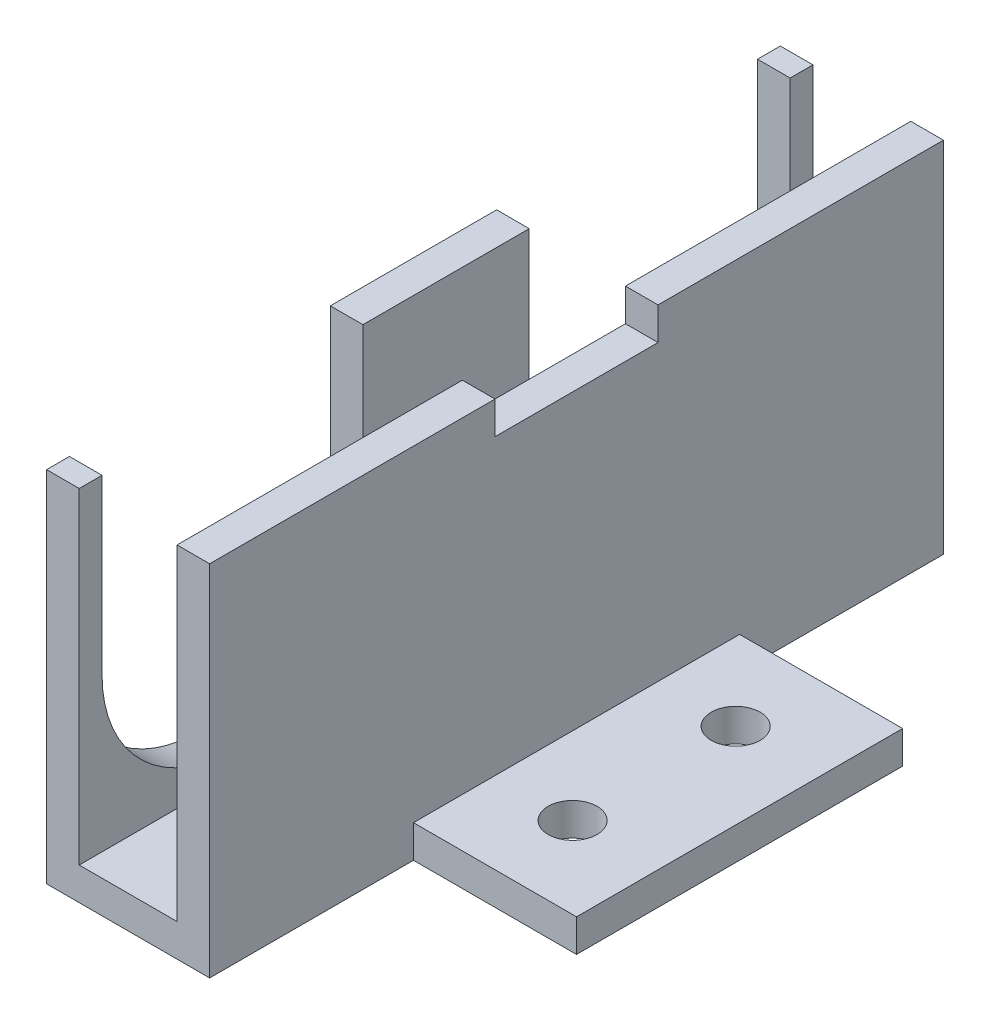
ISO-10303-21;
HEADER;
FILE_DESCRIPTION(('STEP AP214'),'2;1');
FILE_NAME('part.step','',(''),(''),'','','');
FILE_SCHEMA(('AUTOMOTIVE_DESIGN { 1 0 10303 214 1 1 1 1 }'));
ENDSEC;
DATA;
#1=APPLICATION_CONTEXT('core data for automotive mechanical design processes');
#2=APPLICATION_PROTOCOL_DEFINITION('international standard','automotive_design',2000,#1);
#3=PRODUCT_CONTEXT('',#1,'mechanical');
#4=PRODUCT('Part','Part','',(#3));
#5=PRODUCT_RELATED_PRODUCT_CATEGORY('part','',(#4));
#6=PRODUCT_DEFINITION_FORMATION('','',#4);
#7=PRODUCT_DEFINITION_CONTEXT('part definition',#1,'design');
#8=PRODUCT_DEFINITION('design','',#6,#7);
#9=PRODUCT_DEFINITION_SHAPE('','',#8);
#10=(LENGTH_UNIT() NAMED_UNIT(*) SI_UNIT(.MILLI.,.METRE.));
#11=(NAMED_UNIT(*) PLANE_ANGLE_UNIT() SI_UNIT($,.RADIAN.));
#12=(NAMED_UNIT(*) SI_UNIT($,.STERADIAN.) SOLID_ANGLE_UNIT());
#13=UNCERTAINTY_MEASURE_WITH_UNIT(LENGTH_MEASURE(1.E-05),#10,'distance_accuracy_value','');
#14=(GEOMETRIC_REPRESENTATION_CONTEXT(3) GLOBAL_UNCERTAINTY_ASSIGNED_CONTEXT((#13)) GLOBAL_UNIT_ASSIGNED_CONTEXT((#10,
#11,#12)) REPRESENTATION_CONTEXT('',''));
#15=CARTESIAN_POINT('',(0.,0.,0.));
#16=DIRECTION('',(0.,0.,1.));
#17=DIRECTION('',(1.,0.,0.));
#18=AXIS2_PLACEMENT_3D('',#15,#16,#17);
#19=CARTESIAN_POINT('',(8.,20.,45.));
#20=DIRECTION('',(-1.,0.,0.));
#21=DIRECTION('',(0.,-1.,0.));
#22=AXIS2_PLACEMENT_3D('',#19,#20,#21);
#23=PLANE('',#22);
#24=DIRECTION('',(0.,-1.,0.));
#25=VECTOR('',#24,1.);
#26=CARTESIAN_POINT('',(8.,0.,32.5));
#27=LINE('',#26,#25);
#28=CARTESIAN_POINT('',(8.,0.,32.5));
#29=VERTEX_POINT('',#28);
#30=CARTESIAN_POINT('',(8.,-2.,32.5));
#31=VERTEX_POINT('',#30);
#32=EDGE_CURVE('E49',#29,#31,#27,.T.);
#33=ORIENTED_EDGE('',*,*,#32,.F.);
#34=DIRECTION('',(0.,0.,1.));
#35=VECTOR('',#34,1.);
#36=CARTESIAN_POINT('',(8.,0.,32.5));
#37=LINE('',#36,#35);
#38=CARTESIAN_POINT('',(8.,0.,12.5));
#39=VERTEX_POINT('',#38);
#40=EDGE_CURVE('E215',#39,#29,#37,.T.);
#41=ORIENTED_EDGE('',*,*,#40,.F.);
#42=DIRECTION('',(0.,1.,0.));
#43=VECTOR('',#42,1.);
#44=CARTESIAN_POINT('',(8.,0.,12.5));
#45=LINE('',#44,#43);
#46=CARTESIAN_POINT('',(8.,-2.,12.5));
#47=VERTEX_POINT('',#46);
#48=EDGE_CURVE('E55',#47,#39,#45,.T.);
#49=ORIENTED_EDGE('',*,*,#48,.F.);
#50=DIRECTION('',(0.,0.,-1.));
#51=VECTOR('',#50,1.);
#52=CARTESIAN_POINT('',(8.,-2.,45.));
#53=LINE('',#52,#51);
#54=CARTESIAN_POINT('',(8.,-2.,0.));
#55=VERTEX_POINT('',#54);
#56=EDGE_CURVE('E352',#47,#55,#53,.T.);
#57=ORIENTED_EDGE('',*,*,#56,.T.);
#58=DIRECTION('',(0.,1.,0.));
#59=VECTOR('',#58,1.);
#60=CARTESIAN_POINT('',(8.,20.,0.));
#61=LINE('',#60,#59);
#62=CARTESIAN_POINT('',(8.,20.,0.));
#63=VERTEX_POINT('',#62);
#64=EDGE_CURVE('E330',#55,#63,#61,.T.);
#65=ORIENTED_EDGE('',*,*,#64,.T.);
#66=DIRECTION('',(0.,0.,-1.));
#67=VECTOR('',#66,1.);
#68=CARTESIAN_POINT('',(8.,20.,45.));
#69=LINE('',#68,#67);
#70=CARTESIAN_POINT('',(8.,20.,17.5));
#71=VERTEX_POINT('',#70);
#72=EDGE_CURVE('E348',#71,#63,#69,.T.);
#73=ORIENTED_EDGE('',*,*,#72,.F.);
#74=DIRECTION('',(0.,1.,0.));
#75=VECTOR('',#74,1.);
#76=CARTESIAN_POINT('',(8.,20.,17.5));
#77=LINE('',#76,#75);
#78=CARTESIAN_POINT('',(8.,18.,17.5));
#79=VERTEX_POINT('',#78);
#80=EDGE_CURVE('E231',#79,#71,#77,.T.);
#81=ORIENTED_EDGE('',*,*,#80,.F.);
#82=DIRECTION('',(0.,0.,-1.));
#83=VECTOR('',#82,1.);
#84=CARTESIAN_POINT('',(8.,18.,27.5));
#85=LINE('',#84,#83);
#86=CARTESIAN_POINT('',(8.,18.,27.5));
#87=VERTEX_POINT('',#86);
#88=EDGE_CURVE('E221',#87,#79,#85,.T.);
#89=ORIENTED_EDGE('',*,*,#88,.F.);
#90=DIRECTION('',(0.,-1.,0.));
#91=VECTOR('',#90,1.);
#92=CARTESIAN_POINT('',(8.,20.,27.5));
#93=LINE('',#92,#91);
#94=CARTESIAN_POINT('',(8.,20.,27.5));
#95=VERTEX_POINT('',#94);
#96=EDGE_CURVE('E218',#95,#87,#93,.T.);
#97=ORIENTED_EDGE('',*,*,#96,.F.);
#98=CARTESIAN_POINT('',(8.,20.,45.));
#99=VERTEX_POINT('',#98);
#100=EDGE_CURVE('E349',#99,#95,#69,.T.);
#101=ORIENTED_EDGE('',*,*,#100,.F.);
#102=DIRECTION('',(0.,1.,0.));
#103=VECTOR('',#102,1.);
#104=CARTESIAN_POINT('',(8.,20.,45.));
#105=LINE('',#104,#103);
#106=CARTESIAN_POINT('',(8.,-2.,45.));
#107=VERTEX_POINT('',#106);
#108=EDGE_CURVE('E312',#107,#99,#105,.T.);
#109=ORIENTED_EDGE('',*,*,#108,.F.);
#110=EDGE_CURVE('E353',#107,#31,#53,.T.);
#111=ORIENTED_EDGE('',*,*,#110,.T.);
#112=EDGE_LOOP('',(#33,#41,#49,#57,#65,#73,#81,#89,#97,#101,#109,#111));
#113=FACE_BOUND('',#112,.T.);
#114=ADVANCED_FACE('F33',(#113),#23,.F.);
#115=CARTESIAN_POINT('',(6.,20.,45.));
#116=DIRECTION('',(0.,-1.,0.));
#117=DIRECTION('',(0.,0.,-1.));
#118=AXIS2_PLACEMENT_3D('',#115,#116,#117);
#119=PLANE('',#118);
#120=ORIENTED_EDGE('',*,*,#100,.T.);
#121=DIRECTION('',(1.,0.,0.));
#122=VECTOR('',#121,1.);
#123=CARTESIAN_POINT('',(6.,20.,27.5));
#124=LINE('',#123,#122);
#125=CARTESIAN_POINT('',(6.,20.,27.5));
#126=VERTEX_POINT('',#125);
#127=EDGE_CURVE('E241',#126,#95,#124,.T.);
#128=ORIENTED_EDGE('',*,*,#127,.F.);
#129=DIRECTION('',(0.,0.,-1.));
#130=VECTOR('',#129,1.);
#131=CARTESIAN_POINT('',(6.,20.,45.));
#132=LINE('',#131,#130);
#133=CARTESIAN_POINT('',(6.,20.,45.));
#134=VERTEX_POINT('',#133);
#135=EDGE_CURVE('E345',#134,#126,#132,.T.);
#136=ORIENTED_EDGE('',*,*,#135,.F.);
#137=DIRECTION('',(-1.,0.,0.));
#138=VECTOR('',#137,1.);
#139=CARTESIAN_POINT('',(6.,20.,45.));
#140=LINE('',#139,#138);
#141=EDGE_CURVE('E314',#99,#134,#140,.T.);
#142=ORIENTED_EDGE('',*,*,#141,.F.);
#143=EDGE_LOOP('',(#120,#128,#136,#142));
#144=FACE_BOUND('',#143,.T.);
#145=ADVANCED_FACE('F431',(#144),#119,.F.);
#146=CARTESIAN_POINT('',(0.,20.,45.));
#147=DIRECTION('',(-1.,0.,0.));
#148=DIRECTION('',(0.,0.,1.));
#149=AXIS2_PLACEMENT_3D('',#146,#147,#148);
#150=PLANE('',#149);
#151=DIRECTION('',(0.,1.,0.));
#152=VECTOR('',#151,1.);
#153=CARTESIAN_POINT('',(0.,0.,27.6));
#154=LINE('',#153,#152);
#155=CARTESIAN_POINT('',(0.,9.40751036148047,27.6));
#156=VERTEX_POINT('',#155);
#157=CARTESIAN_POINT('',(0.,20.,27.6));
#158=VERTEX_POINT('',#157);
#159=EDGE_CURVE('E250',#156,#158,#154,.T.);
#160=ORIENTED_EDGE('',*,*,#159,.F.);
#161=CARTESIAN_POINT('',(0.,9.40751036148047,35.6));
#162=DIRECTION('',(-1.,0.,0.));
#163=DIRECTION('',(0.,0.,1.));
#164=AXIS2_PLACEMENT_3D('',#161,#162,#163);
#165=CIRCLE('',#164,8.);
#166=CARTESIAN_POINT('',(0.,9.40751036148047,43.6));
#167=VERTEX_POINT('',#166);
#168=EDGE_CURVE('E252',#156,#167,#165,.T.);
#169=ORIENTED_EDGE('',*,*,#168,.T.);
#170=DIRECTION('',(0.,1.,0.));
#171=VECTOR('',#170,1.);
#172=CARTESIAN_POINT('',(0.,0.,43.6));
#173=LINE('',#172,#171);
#174=CARTESIAN_POINT('',(0.,20.,43.6));
#175=VERTEX_POINT('',#174);
#176=EDGE_CURVE('E256',#167,#175,#173,.T.);
#177=ORIENTED_EDGE('',*,*,#176,.T.);
#178=DIRECTION('',(0.,0.,-1.));
#179=VECTOR('',#178,1.);
#180=CARTESIAN_POINT('',(0.,20.,45.));
#181=LINE('',#180,#179);
#182=CARTESIAN_POINT('',(0.,20.,45.));
#183=VERTEX_POINT('',#182);
#184=EDGE_CURVE('E11',#183,#175,#181,.T.);
#185=ORIENTED_EDGE('',*,*,#184,.F.);
#186=DIRECTION('',(0.,1.,0.));
#187=VECTOR('',#186,1.);
#188=CARTESIAN_POINT('',(0.,20.,45.));
#189=LINE('',#188,#187);
#190=CARTESIAN_POINT('',(0.,0.,45.));
#191=VERTEX_POINT('',#190);
#192=EDGE_CURVE('E302',#191,#183,#189,.T.);
#193=ORIENTED_EDGE('',*,*,#192,.F.);
#194=DIRECTION('',(0.,0.,-1.));
#195=VECTOR('',#194,1.);
#196=CARTESIAN_POINT('',(0.,0.,45.));
#197=LINE('',#196,#195);
#198=CARTESIAN_POINT('',(0.,0.,0.));
#199=VERTEX_POINT('',#198);
#200=EDGE_CURVE('E320',#191,#199,#197,.T.);
#201=ORIENTED_EDGE('',*,*,#200,.T.);
#202=DIRECTION('',(0.,1.,0.));
#203=VECTOR('',#202,1.);
#204=CARTESIAN_POINT('',(0.,20.,0.));
#205=LINE('',#204,#203);
#206=CARTESIAN_POINT('',(0.,20.,0.));
#207=VERTEX_POINT('',#206);
#208=EDGE_CURVE('E270',#199,#207,#205,.T.);
#209=ORIENTED_EDGE('',*,*,#208,.T.);
#210=CARTESIAN_POINT('',(0.,20.,1.4));
#211=VERTEX_POINT('',#210);
#212=EDGE_CURVE('E42',#211,#207,#181,.T.);
#213=ORIENTED_EDGE('',*,*,#212,.F.);
#214=DIRECTION('',(0.,1.,0.));
#215=VECTOR('',#214,1.);
#216=CARTESIAN_POINT('',(0.,0.,1.4));
#217=LINE('',#216,#215);
#218=CARTESIAN_POINT('',(0.,9.40751036148047,1.4));
#219=VERTEX_POINT('',#218);
#220=EDGE_CURVE('E278',#219,#211,#217,.T.);
#221=ORIENTED_EDGE('',*,*,#220,.F.);
#222=CARTESIAN_POINT('',(0.,9.40751036148047,9.4));
#223=DIRECTION('',(-1.,0.,0.));
#224=DIRECTION('',(0.,0.,1.));
#225=AXIS2_PLACEMENT_3D('',#222,#223,#224);
#226=CIRCLE('',#225,8.);
#227=CARTESIAN_POINT('',(0.,9.40751036148047,17.4));
#228=VERTEX_POINT('',#227);
#229=EDGE_CURVE('E280',#219,#228,#226,.T.);
#230=ORIENTED_EDGE('',*,*,#229,.T.);
#231=DIRECTION('',(0.,1.,0.));
#232=VECTOR('',#231,1.);
#233=CARTESIAN_POINT('',(0.,0.,17.4));
#234=LINE('',#233,#232);
#235=CARTESIAN_POINT('',(0.,20.,17.4));
#236=VERTEX_POINT('',#235);
#237=EDGE_CURVE('E284',#228,#236,#234,.T.);
#238=ORIENTED_EDGE('',*,*,#237,.T.);
#239=EDGE_CURVE('E41',#158,#236,#181,.T.);
#240=ORIENTED_EDGE('',*,*,#239,.F.);
#241=EDGE_LOOP('',(#160,#169,#177,#185,#193,#201,#209,#213,#221,#230,#238,#240));
#242=FACE_BOUND('',#241,.T.);
#243=ADVANCED_FACE('F35',(#242),#150,.F.);
#244=CARTESIAN_POINT('',(-2.,20.,45.));
#245=DIRECTION('',(0.,-1.,0.));
#246=DIRECTION('',(0.,0.,-1.));
#247=AXIS2_PLACEMENT_3D('',#244,#245,#246);
#248=PLANE('',#247);
#249=DIRECTION('',(-1.,0.,0.));
#250=VECTOR('',#249,1.);
#251=CARTESIAN_POINT('',(0.,20.,27.6));
#252=LINE('',#251,#250);
#253=CARTESIAN_POINT('',(-2.,20.,27.6));
#254=VERTEX_POINT('',#253);
#255=EDGE_CURVE('E268',#158,#254,#252,.T.);
#256=ORIENTED_EDGE('',*,*,#255,.F.);
#257=ORIENTED_EDGE('',*,*,#239,.T.);
#258=DIRECTION('',(-1.,0.,0.));
#259=VECTOR('',#258,1.);
#260=CARTESIAN_POINT('',(0.,20.,17.4));
#261=LINE('',#260,#259);
#262=CARTESIAN_POINT('',(-2.,20.,17.4));
#263=VERTEX_POINT('',#262);
#264=EDGE_CURVE('E295',#236,#263,#261,.T.);
#265=ORIENTED_EDGE('',*,*,#264,.T.);
#266=DIRECTION('',(0.,0.,-1.));
#267=VECTOR('',#266,1.);
#268=CARTESIAN_POINT('',(-2.,20.,45.));
#269=LINE('',#268,#267);
#270=EDGE_CURVE('E360',#254,#263,#269,.T.);
#271=ORIENTED_EDGE('',*,*,#270,.F.);
#272=EDGE_LOOP('',(#256,#257,#265,#271));
#273=FACE_BOUND('',#272,.T.);
#274=ADVANCED_FACE('F404',(#273),#248,.F.);
#275=DIRECTION('',(-1.,0.,0.));
#276=VECTOR('',#275,1.);
#277=CARTESIAN_POINT('',(0.,20.,1.4));
#278=LINE('',#277,#276);
#279=CARTESIAN_POINT('',(-2.,20.,1.4));
#280=VERTEX_POINT('',#279);
#281=EDGE_CURVE('E264',#211,#280,#278,.T.);
#282=ORIENTED_EDGE('',*,*,#281,.F.);
#283=ORIENTED_EDGE('',*,*,#212,.T.);
#284=DIRECTION('',(-1.,0.,0.));
#285=VECTOR('',#284,1.);
#286=CARTESIAN_POINT('',(-2.,20.,0.));
#287=LINE('',#286,#285);
#288=CARTESIAN_POINT('',(-2.,20.,0.));
#289=VERTEX_POINT('',#288);
#290=EDGE_CURVE('E323',#207,#289,#287,.T.);
#291=ORIENTED_EDGE('',*,*,#290,.T.);
#292=EDGE_CURVE('E357',#280,#289,#269,.T.);
#293=ORIENTED_EDGE('',*,*,#292,.F.);
#294=EDGE_LOOP('',(#282,#283,#291,#293));
#295=FACE_BOUND('',#294,.T.);
#296=ADVANCED_FACE('F374',(#295),#248,.F.);
#297=CARTESIAN_POINT('',(-2.,-2.,45.));
#298=DIRECTION('',(1.,0.,0.));
#299=DIRECTION('',(0.,0.,-1.));
#300=AXIS2_PLACEMENT_3D('',#297,#298,#299);
#301=PLANE('',#300);
#302=DIRECTION('',(0.,1.,0.));
#303=VECTOR('',#302,1.);
#304=CARTESIAN_POINT('',(-2.,0.,27.6));
#305=LINE('',#304,#303);
#306=CARTESIAN_POINT('',(-2.,9.40751036148047,27.6));
#307=VERTEX_POINT('',#306);
#308=EDGE_CURVE('E260',#307,#254,#305,.T.);
#309=ORIENTED_EDGE('',*,*,#308,.T.);
#310=ORIENTED_EDGE('',*,*,#270,.T.);
#311=DIRECTION('',(0.,1.,0.));
#312=VECTOR('',#311,1.);
#313=CARTESIAN_POINT('',(-2.,0.,17.4));
#314=LINE('',#313,#312);
#315=CARTESIAN_POINT('',(-2.,9.40751036148047,17.4));
#316=VERTEX_POINT('',#315);
#317=EDGE_CURVE('E281',#316,#263,#314,.T.);
#318=ORIENTED_EDGE('',*,*,#317,.F.);
#319=CARTESIAN_POINT('',(-2.,9.40751036148047,9.4));
#320=DIRECTION('',(-1.,0.,0.));
#321=DIRECTION('',(0.,0.,1.));
#322=AXIS2_PLACEMENT_3D('',#319,#320,#321);
#323=CIRCLE('',#322,8.);
#324=CARTESIAN_POINT('',(-2.,9.40751036148047,1.4));
#325=VERTEX_POINT('',#324);
#326=EDGE_CURVE('E290',#325,#316,#323,.T.);
#327=ORIENTED_EDGE('',*,*,#326,.F.);
#328=DIRECTION('',(0.,1.,0.));
#329=VECTOR('',#328,1.);
#330=CARTESIAN_POINT('',(-2.,0.,1.4));
#331=LINE('',#330,#329);
#332=EDGE_CURVE('E243',#325,#280,#331,.T.);
#333=ORIENTED_EDGE('',*,*,#332,.T.);
#334=ORIENTED_EDGE('',*,*,#292,.T.);
#335=DIRECTION('',(0.,-1.,0.));
#336=VECTOR('',#335,1.);
#337=CARTESIAN_POINT('',(-2.,-2.,0.));
#338=LINE('',#337,#336);
#339=CARTESIAN_POINT('',(-2.,-2.,0.));
#340=VERTEX_POINT('',#339);
#341=EDGE_CURVE('E326',#289,#340,#338,.T.);
#342=ORIENTED_EDGE('',*,*,#341,.T.);
#343=DIRECTION('',(0.,0.,-1.));
#344=VECTOR('',#343,1.);
#345=CARTESIAN_POINT('',(-2.,-2.,45.));
#346=LINE('',#345,#344);
#347=CARTESIAN_POINT('',(-2.,-2.,45.));
#348=VERTEX_POINT('',#347);
#349=EDGE_CURVE('E355',#348,#340,#346,.T.);
#350=ORIENTED_EDGE('',*,*,#349,.F.);
#351=DIRECTION('',(0.,-1.,0.));
#352=VECTOR('',#351,1.);
#353=CARTESIAN_POINT('',(-2.,-2.,45.));
#354=LINE('',#353,#352);
#355=CARTESIAN_POINT('',(-2.,20.,45.));
#356=VERTEX_POINT('',#355);
#357=EDGE_CURVE('E308',#356,#348,#354,.T.);
#358=ORIENTED_EDGE('',*,*,#357,.F.);
#359=CARTESIAN_POINT('',(-2.,20.,43.6));
#360=VERTEX_POINT('',#359);
#361=EDGE_CURVE('E358',#356,#360,#269,.T.);
#362=ORIENTED_EDGE('',*,*,#361,.T.);
#363=DIRECTION('',(0.,1.,0.));
#364=VECTOR('',#363,1.);
#365=CARTESIAN_POINT('',(-2.,0.,43.6));
#366=LINE('',#365,#364);
#367=CARTESIAN_POINT('',(-2.,9.40751036148047,43.6));
#368=VERTEX_POINT('',#367);
#369=EDGE_CURVE('E253',#368,#360,#366,.T.);
#370=ORIENTED_EDGE('',*,*,#369,.F.);
#371=CARTESIAN_POINT('',(-2.,9.40751036148047,35.6));
#372=DIRECTION('',(-1.,0.,0.));
#373=DIRECTION('',(0.,0.,1.));
#374=AXIS2_PLACEMENT_3D('',#371,#372,#373);
#375=CIRCLE('',#374,8.);
#376=EDGE_CURVE('E263',#307,#368,#375,.T.);
#377=ORIENTED_EDGE('',*,*,#376,.F.);
#378=EDGE_LOOP('',(#309,#310,#318,#327,#333,#334,#342,#350,#358,#362,#370,#377));
#379=FACE_BOUND('',#378,.T.);
#380=ADVANCED_FACE('F367',(#379),#301,.F.);
#381=ORIENTED_EDGE('',*,*,#184,.T.);
#382=DIRECTION('',(-1.,0.,0.));
#383=VECTOR('',#382,1.);
#384=CARTESIAN_POINT('',(0.,20.,43.6));
#385=LINE('',#384,#383);
#386=EDGE_CURVE('E271',#175,#360,#385,.T.);
#387=ORIENTED_EDGE('',*,*,#386,.T.);
#388=ORIENTED_EDGE('',*,*,#361,.F.);
#389=DIRECTION('',(-1.,0.,0.));
#390=VECTOR('',#389,1.);
#391=CARTESIAN_POINT('',(-2.,20.,45.));
#392=LINE('',#391,#390);
#393=EDGE_CURVE('E305',#183,#356,#392,.T.);
#394=ORIENTED_EDGE('',*,*,#393,.F.);
#395=EDGE_LOOP('',(#381,#387,#388,#394));
#396=FACE_BOUND('',#395,.T.);
#397=ADVANCED_FACE('F388',(#396),#248,.F.);
#398=CARTESIAN_POINT('',(8.,-2.,45.));
#399=DIRECTION('',(0.,1.,0.));
#400=DIRECTION('',(-1.,0.,0.));
#401=AXIS2_PLACEMENT_3D('',#398,#399,#400);
#402=PLANE('',#401);
#403=CARTESIAN_POINT('',(12.760241105676,-2.,27.5));
#404=DIRECTION('',(0.,1.,0.));
#405=DIRECTION('',(-1.,0.,0.));
#406=AXIS2_PLACEMENT_3D('',#403,#404,#405);
#407=CIRCLE('',#406,1.5);
#408=CARTESIAN_POINT('',(11.260241105676,-2.,27.5));
#409=VERTEX_POINT('',#408);
#410=EDGE_CURVE('E671',#409,#409,#407,.T.);
#411=ORIENTED_EDGE('',*,*,#410,.T.);
#412=EDGE_LOOP('',(#411));
#413=FACE_BOUND('',#412,.T.);
#414=CARTESIAN_POINT('',(12.760241105676,-2.,17.5));
#415=DIRECTION('',(0.,1.,0.));
#416=DIRECTION('',(-1.,0.,0.));
#417=AXIS2_PLACEMENT_3D('',#414,#415,#416);
#418=CIRCLE('',#417,1.5);
#419=CARTESIAN_POINT('',(11.260241105676,-2.,17.5));
#420=VERTEX_POINT('',#419);
#421=EDGE_CURVE('E675',#420,#420,#418,.T.);
#422=ORIENTED_EDGE('',*,*,#421,.T.);
#423=EDGE_LOOP('',(#422));
#424=FACE_BOUND('',#423,.T.);
#425=DIRECTION('',(1.,0.,0.));
#426=VECTOR('',#425,1.);
#427=CARTESIAN_POINT('',(8.,-2.,0.));
#428=LINE('',#427,#426);
#429=EDGE_CURVE('E328',#340,#55,#428,.T.);
#430=ORIENTED_EDGE('',*,*,#429,.T.);
#431=ORIENTED_EDGE('',*,*,#56,.F.);
#432=DIRECTION('',(-1.,0.,0.));
#433=VECTOR('',#432,1.);
#434=CARTESIAN_POINT('',(18.,-2.,12.5));
#435=LINE('',#434,#433);
#436=CARTESIAN_POINT('',(18.,-2.,12.5));
#437=VERTEX_POINT('',#436);
#438=EDGE_CURVE('E202',#437,#47,#435,.T.);
#439=ORIENTED_EDGE('',*,*,#438,.F.);
#440=DIRECTION('',(0.,0.,-1.));
#441=VECTOR('',#440,1.);
#442=CARTESIAN_POINT('',(18.,-2.,32.5));
#443=LINE('',#442,#441);
#444=CARTESIAN_POINT('',(18.,-2.,32.5));
#445=VERTEX_POINT('',#444);
#446=EDGE_CURVE('E194',#445,#437,#443,.T.);
#447=ORIENTED_EDGE('',*,*,#446,.F.);
#448=DIRECTION('',(-1.,0.,0.));
#449=VECTOR('',#448,1.);
#450=CARTESIAN_POINT('',(18.,-2.,32.5));
#451=LINE('',#450,#449);
#452=EDGE_CURVE('E200',#445,#31,#451,.T.);
#453=ORIENTED_EDGE('',*,*,#452,.T.);
#454=ORIENTED_EDGE('',*,*,#110,.F.);
#455=DIRECTION('',(1.,0.,0.));
#456=VECTOR('',#455,1.);
#457=CARTESIAN_POINT('',(8.,-2.,45.));
#458=LINE('',#457,#456);
#459=EDGE_CURVE('E310',#348,#107,#458,.T.);
#460=ORIENTED_EDGE('',*,*,#459,.F.);
#461=ORIENTED_EDGE('',*,*,#349,.T.);
#462=EDGE_LOOP('',(#430,#431,#439,#447,#453,#454,#460,#461));
#463=FACE_BOUND('',#462,.T.);
#464=ADVANCED_FACE('F197',(#413,#424,#463),#402,.F.);
#465=CARTESIAN_POINT('',(6.,20.,17.5));
#466=VERTEX_POINT('',#465);
#467=CARTESIAN_POINT('',(6.,20.,0.));
#468=VERTEX_POINT('',#467);
#469=EDGE_CURVE('E344',#466,#468,#132,.T.);
#470=ORIENTED_EDGE('',*,*,#469,.F.);
#471=DIRECTION('',(1.,0.,0.));
#472=VECTOR('',#471,1.);
#473=CARTESIAN_POINT('',(6.,20.,17.5));
#474=LINE('',#473,#472);
#475=EDGE_CURVE('E244',#466,#71,#474,.T.);
#476=ORIENTED_EDGE('',*,*,#475,.T.);
#477=ORIENTED_EDGE('',*,*,#72,.T.);
#478=DIRECTION('',(-1.,0.,0.));
#479=VECTOR('',#478,1.);
#480=CARTESIAN_POINT('',(6.,20.,0.));
#481=LINE('',#480,#479);
#482=EDGE_CURVE('E333',#63,#468,#481,.T.);
#483=ORIENTED_EDGE('',*,*,#482,.T.);
#484=EDGE_LOOP('',(#470,#476,#477,#483));
#485=FACE_BOUND('',#484,.T.);
#486=ADVANCED_FACE('F427',(#485),#119,.F.);
#487=CARTESIAN_POINT('',(6.,0.,45.));
#488=DIRECTION('',(1.,0.,0.));
#489=DIRECTION('',(0.,0.,-1.));
#490=AXIS2_PLACEMENT_3D('',#487,#488,#489);
#491=PLANE('',#490);
#492=ORIENTED_EDGE('',*,*,#135,.T.);
#493=DIRECTION('',(0.,-1.,0.));
#494=VECTOR('',#493,1.);
#495=CARTESIAN_POINT('',(6.,20.,27.5));
#496=LINE('',#495,#494);
#497=CARTESIAN_POINT('',(6.,18.,27.5));
#498=VERTEX_POINT('',#497);
#499=EDGE_CURVE('E227',#126,#498,#496,.T.);
#500=ORIENTED_EDGE('',*,*,#499,.T.);
#501=DIRECTION('',(0.,0.,-1.));
#502=VECTOR('',#501,1.);
#503=CARTESIAN_POINT('',(6.,18.,27.5));
#504=LINE('',#503,#502);
#505=CARTESIAN_POINT('',(6.,18.,17.5));
#506=VERTEX_POINT('',#505);
#507=EDGE_CURVE('E230',#498,#506,#504,.T.);
#508=ORIENTED_EDGE('',*,*,#507,.T.);
#509=DIRECTION('',(0.,1.,0.));
#510=VECTOR('',#509,1.);
#511=CARTESIAN_POINT('',(6.,20.,17.5));
#512=LINE('',#511,#510);
#513=EDGE_CURVE('E234',#506,#466,#512,.T.);
#514=ORIENTED_EDGE('',*,*,#513,.T.);
#515=ORIENTED_EDGE('',*,*,#469,.T.);
#516=DIRECTION('',(0.,-1.,0.));
#517=VECTOR('',#516,1.);
#518=CARTESIAN_POINT('',(6.,0.,0.));
#519=LINE('',#518,#517);
#520=CARTESIAN_POINT('',(6.,0.,0.));
#521=VERTEX_POINT('',#520);
#522=EDGE_CURVE('E336',#468,#521,#519,.T.);
#523=ORIENTED_EDGE('',*,*,#522,.T.);
#524=DIRECTION('',(0.,0.,-1.));
#525=VECTOR('',#524,1.);
#526=CARTESIAN_POINT('',(6.,0.,45.));
#527=LINE('',#526,#525);
#528=CARTESIAN_POINT('',(6.,0.,45.));
#529=VERTEX_POINT('',#528);
#530=EDGE_CURVE('E341',#529,#521,#527,.T.);
#531=ORIENTED_EDGE('',*,*,#530,.F.);
#532=DIRECTION('',(0.,-1.,0.));
#533=VECTOR('',#532,1.);
#534=CARTESIAN_POINT('',(6.,0.,45.));
#535=LINE('',#534,#533);
#536=EDGE_CURVE('E316',#134,#529,#535,.T.);
#537=ORIENTED_EDGE('',*,*,#536,.F.);
#538=EDGE_LOOP('',(#492,#500,#508,#514,#515,#523,#531,#537));
#539=FACE_BOUND('',#538,.T.);
#540=ADVANCED_FACE('F424',(#539),#491,.F.);
#541=CARTESIAN_POINT('',(0.,0.,45.));
#542=DIRECTION('',(0.,-1.,0.));
#543=DIRECTION('',(0.,0.,-1.));
#544=AXIS2_PLACEMENT_3D('',#541,#542,#543);
#545=PLANE('',#544);
#546=DIRECTION('',(-1.,0.,0.));
#547=VECTOR('',#546,1.);
#548=CARTESIAN_POINT('',(0.,0.,0.));
#549=LINE('',#548,#547);
#550=EDGE_CURVE('E306',#521,#199,#549,.T.);
#551=ORIENTED_EDGE('',*,*,#550,.T.);
#552=ORIENTED_EDGE('',*,*,#200,.F.);
#553=DIRECTION('',(-1.,0.,0.));
#554=VECTOR('',#553,1.);
#555=CARTESIAN_POINT('',(0.,0.,45.));
#556=LINE('',#555,#554);
#557=EDGE_CURVE('E318',#529,#191,#556,.T.);
#558=ORIENTED_EDGE('',*,*,#557,.F.);
#559=ORIENTED_EDGE('',*,*,#530,.T.);
#560=EDGE_LOOP('',(#551,#552,#558,#559));
#561=FACE_BOUND('',#560,.T.);
#562=ADVANCED_FACE('F419',(#561),#545,.F.);
#563=CARTESIAN_POINT('',(0.,0.,45.));
#564=DIRECTION('',(0.,0.,1.));
#565=DIRECTION('',(1.,0.,0.));
#566=AXIS2_PLACEMENT_3D('',#563,#564,#565);
#567=PLANE('',#566);
#568=ORIENTED_EDGE('',*,*,#192,.T.);
#569=ORIENTED_EDGE('',*,*,#393,.T.);
#570=ORIENTED_EDGE('',*,*,#357,.T.);
#571=ORIENTED_EDGE('',*,*,#459,.T.);
#572=ORIENTED_EDGE('',*,*,#108,.T.);
#573=ORIENTED_EDGE('',*,*,#141,.T.);
#574=ORIENTED_EDGE('',*,*,#536,.T.);
#575=ORIENTED_EDGE('',*,*,#557,.T.);
#576=EDGE_LOOP('',(#568,#569,#570,#571,#572,#573,#574,#575));
#577=FACE_BOUND('',#576,.T.);
#578=ADVANCED_FACE('F384',(#577),#567,.T.);
#579=CARTESIAN_POINT('',(0.,0.,0.));
#580=DIRECTION('',(0.,0.,1.));
#581=DIRECTION('',(1.,0.,0.));
#582=AXIS2_PLACEMENT_3D('',#579,#580,#581);
#583=PLANE('',#582);
#584=ORIENTED_EDGE('',*,*,#208,.F.);
#585=ORIENTED_EDGE('',*,*,#550,.F.);
#586=ORIENTED_EDGE('',*,*,#522,.F.);
#587=ORIENTED_EDGE('',*,*,#482,.F.);
#588=ORIENTED_EDGE('',*,*,#64,.F.);
#589=ORIENTED_EDGE('',*,*,#429,.F.);
#590=ORIENTED_EDGE('',*,*,#341,.F.);
#591=ORIENTED_EDGE('',*,*,#290,.F.);
#592=EDGE_LOOP('',(#584,#585,#586,#587,#588,#589,#590,#591));
#593=FACE_BOUND('',#592,.T.);
#594=ADVANCED_FACE('F379',(#593),#583,.F.);
#595=CARTESIAN_POINT('',(0.,0.,1.4));
#596=DIRECTION('',(0.,0.,1.));
#597=DIRECTION('',(1.,0.,0.));
#598=AXIS2_PLACEMENT_3D('',#595,#596,#597);
#599=PLANE('',#598);
#600=ORIENTED_EDGE('',*,*,#332,.F.);
#601=DIRECTION('',(-1.,0.,0.));
#602=VECTOR('',#601,1.);
#603=CARTESIAN_POINT('',(0.,9.40751036148047,1.4));
#604=LINE('',#603,#602);
#605=EDGE_CURVE('E287',#219,#325,#604,.T.);
#606=ORIENTED_EDGE('',*,*,#605,.F.);
#607=ORIENTED_EDGE('',*,*,#220,.T.);
#608=ORIENTED_EDGE('',*,*,#281,.T.);
#609=EDGE_LOOP('',(#600,#606,#607,#608));
#610=FACE_BOUND('',#609,.T.);
#611=ADVANCED_FACE('F414',(#610),#599,.T.);
#612=CARTESIAN_POINT('',(0.,0.,17.4));
#613=DIRECTION('',(0.,0.,1.));
#614=DIRECTION('',(1.,0.,0.));
#615=AXIS2_PLACEMENT_3D('',#612,#613,#614);
#616=PLANE('',#615);
#617=ORIENTED_EDGE('',*,*,#317,.T.);
#618=ORIENTED_EDGE('',*,*,#264,.F.);
#619=ORIENTED_EDGE('',*,*,#237,.F.);
#620=DIRECTION('',(-1.,0.,0.));
#621=VECTOR('',#620,1.);
#622=CARTESIAN_POINT('',(0.,9.40751036148047,17.4));
#623=LINE('',#622,#621);
#624=EDGE_CURVE('E298',#228,#316,#623,.T.);
#625=ORIENTED_EDGE('',*,*,#624,.T.);
#626=EDGE_LOOP('',(#617,#618,#619,#625));
#627=FACE_BOUND('',#626,.T.);
#628=ADVANCED_FACE('F408',(#627),#616,.F.);
#629=CARTESIAN_POINT('',(0.,9.40751036148047,9.4));
#630=DIRECTION('',(-1.,0.,0.));
#631=DIRECTION('',(0.,0.,1.));
#632=AXIS2_PLACEMENT_3D('',#629,#630,#631);
#633=CYLINDRICAL_SURFACE('',#632,8.);
#634=ORIENTED_EDGE('',*,*,#326,.T.);
#635=ORIENTED_EDGE('',*,*,#624,.F.);
#636=ORIENTED_EDGE('',*,*,#229,.F.);
#637=ORIENTED_EDGE('',*,*,#605,.T.);
#638=EDGE_LOOP('',(#634,#635,#636,#637));
#639=FACE_BOUND('',#638,.T.);
#640=ADVANCED_FACE('F412',(#639),#633,.F.);
#641=CARTESIAN_POINT('',(0.,0.,27.6));
#642=DIRECTION('',(0.,0.,1.));
#643=DIRECTION('',(1.,0.,0.));
#644=AXIS2_PLACEMENT_3D('',#641,#642,#643);
#645=PLANE('',#644);
#646=ORIENTED_EDGE('',*,*,#308,.F.);
#647=DIRECTION('',(-1.,0.,0.));
#648=VECTOR('',#647,1.);
#649=CARTESIAN_POINT('',(0.,9.40751036148047,27.6));
#650=LINE('',#649,#648);
#651=EDGE_CURVE('E259',#156,#307,#650,.T.);
#652=ORIENTED_EDGE('',*,*,#651,.F.);
#653=ORIENTED_EDGE('',*,*,#159,.T.);
#654=ORIENTED_EDGE('',*,*,#255,.T.);
#655=EDGE_LOOP('',(#646,#652,#653,#654));
#656=FACE_BOUND('',#655,.T.);
#657=ADVANCED_FACE('F491',(#656),#645,.T.);
#658=CARTESIAN_POINT('',(0.,0.,43.6));
#659=DIRECTION('',(0.,0.,1.));
#660=DIRECTION('',(1.,0.,0.));
#661=AXIS2_PLACEMENT_3D('',#658,#659,#660);
#662=PLANE('',#661);
#663=ORIENTED_EDGE('',*,*,#369,.T.);
#664=ORIENTED_EDGE('',*,*,#386,.F.);
#665=ORIENTED_EDGE('',*,*,#176,.F.);
#666=DIRECTION('',(-1.,0.,0.));
#667=VECTOR('',#666,1.);
#668=CARTESIAN_POINT('',(0.,9.40751036148047,43.6));
#669=LINE('',#668,#667);
#670=EDGE_CURVE('E274',#167,#368,#669,.T.);
#671=ORIENTED_EDGE('',*,*,#670,.T.);
#672=EDGE_LOOP('',(#663,#664,#665,#671));
#673=FACE_BOUND('',#672,.T.);
#674=ADVANCED_FACE('F391',(#673),#662,.F.);
#675=CARTESIAN_POINT('',(0.,9.40751036148047,35.6));
#676=DIRECTION('',(-1.,0.,0.));
#677=DIRECTION('',(0.,0.,1.));
#678=AXIS2_PLACEMENT_3D('',#675,#676,#677);
#679=CYLINDRICAL_SURFACE('',#678,8.);
#680=ORIENTED_EDGE('',*,*,#376,.T.);
#681=ORIENTED_EDGE('',*,*,#670,.F.);
#682=ORIENTED_EDGE('',*,*,#168,.F.);
#683=ORIENTED_EDGE('',*,*,#651,.T.);
#684=EDGE_LOOP('',(#680,#681,#682,#683));
#685=FACE_BOUND('',#684,.T.);
#686=ADVANCED_FACE('F397',(#685),#679,.F.);
#687=CARTESIAN_POINT('',(6.,20.,27.5));
#688=DIRECTION('',(0.,0.,1.));
#689=DIRECTION('',(1.,0.,0.));
#690=AXIS2_PLACEMENT_3D('',#687,#688,#689);
#691=PLANE('',#690);
#692=ORIENTED_EDGE('',*,*,#96,.T.);
#693=DIRECTION('',(1.,0.,0.));
#694=VECTOR('',#693,1.);
#695=CARTESIAN_POINT('',(6.,18.,27.5));
#696=LINE('',#695,#694);
#697=EDGE_CURVE('E236',#498,#87,#696,.T.);
#698=ORIENTED_EDGE('',*,*,#697,.F.);
#699=ORIENTED_EDGE('',*,*,#499,.F.);
#700=ORIENTED_EDGE('',*,*,#127,.T.);
#701=EDGE_LOOP('',(#692,#698,#699,#700));
#702=FACE_BOUND('',#701,.T.);
#703=ADVANCED_FACE('F516',(#702),#691,.F.);
#704=CARTESIAN_POINT('',(6.,20.,17.5));
#705=DIRECTION('',(0.,0.,-1.));
#706=DIRECTION('',(-1.,0.,0.));
#707=AXIS2_PLACEMENT_3D('',#704,#705,#706);
#708=PLANE('',#707);
#709=ORIENTED_EDGE('',*,*,#80,.T.);
#710=ORIENTED_EDGE('',*,*,#475,.F.);
#711=ORIENTED_EDGE('',*,*,#513,.F.);
#712=DIRECTION('',(1.,0.,0.));
#713=VECTOR('',#712,1.);
#714=CARTESIAN_POINT('',(6.,18.,17.5));
#715=LINE('',#714,#713);
#716=EDGE_CURVE('E247',#506,#79,#715,.T.);
#717=ORIENTED_EDGE('',*,*,#716,.T.);
#718=EDGE_LOOP('',(#709,#710,#711,#717));
#719=FACE_BOUND('',#718,.T.);
#720=ADVANCED_FACE('F547',(#719),#708,.F.);
#721=CARTESIAN_POINT('',(6.,18.,27.5));
#722=DIRECTION('',(0.,-1.,0.));
#723=DIRECTION('',(1.,0.,0.));
#724=AXIS2_PLACEMENT_3D('',#721,#722,#723);
#725=PLANE('',#724);
#726=ORIENTED_EDGE('',*,*,#88,.T.);
#727=ORIENTED_EDGE('',*,*,#716,.F.);
#728=ORIENTED_EDGE('',*,*,#507,.F.);
#729=ORIENTED_EDGE('',*,*,#697,.T.);
#730=EDGE_LOOP('',(#726,#727,#728,#729));
#731=FACE_BOUND('',#730,.T.);
#732=ADVANCED_FACE('F557',(#731),#725,.F.);
#733=CARTESIAN_POINT('',(18.,0.,32.5));
#734=DIRECTION('',(0.,0.,-1.));
#735=DIRECTION('',(-1.,0.,0.));
#736=AXIS2_PLACEMENT_3D('',#733,#734,#735);
#737=PLANE('',#736);
#738=ORIENTED_EDGE('',*,*,#32,.T.);
#739=ORIENTED_EDGE('',*,*,#452,.F.);
#740=DIRECTION('',(0.,-1.,0.));
#741=VECTOR('',#740,1.);
#742=CARTESIAN_POINT('',(18.,0.,32.5));
#743=LINE('',#742,#741);
#744=CARTESIAN_POINT('',(18.,0.,32.5));
#745=VERTEX_POINT('',#744);
#746=EDGE_CURVE('E206',#745,#445,#743,.T.);
#747=ORIENTED_EDGE('',*,*,#746,.F.);
#748=DIRECTION('',(-1.,0.,0.));
#749=VECTOR('',#748,1.);
#750=CARTESIAN_POINT('',(18.,0.,32.5));
#751=LINE('',#750,#749);
#752=EDGE_CURVE('E686',#745,#29,#751,.T.);
#753=ORIENTED_EDGE('',*,*,#752,.T.);
#754=EDGE_LOOP('',(#738,#739,#747,#753));
#755=FACE_BOUND('',#754,.T.);
#756=ADVANCED_FACE('F217',(#755),#737,.F.);
#757=CARTESIAN_POINT('',(18.,0.,12.5));
#758=DIRECTION('',(0.,0.,1.));
#759=DIRECTION('',(0.,-1.,0.));
#760=AXIS2_PLACEMENT_3D('',#757,#758,#759);
#761=PLANE('',#760);
#762=ORIENTED_EDGE('',*,*,#48,.T.);
#763=DIRECTION('',(-1.,0.,0.));
#764=VECTOR('',#763,1.);
#765=CARTESIAN_POINT('',(18.,0.,12.5));
#766=LINE('',#765,#764);
#767=CARTESIAN_POINT('',(18.,0.,12.5));
#768=VERTEX_POINT('',#767);
#769=EDGE_CURVE('E223',#768,#39,#766,.T.);
#770=ORIENTED_EDGE('',*,*,#769,.F.);
#771=DIRECTION('',(0.,1.,0.));
#772=VECTOR('',#771,1.);
#773=CARTESIAN_POINT('',(18.,0.,12.5));
#774=LINE('',#773,#772);
#775=EDGE_CURVE('E205',#437,#768,#774,.T.);
#776=ORIENTED_EDGE('',*,*,#775,.F.);
#777=ORIENTED_EDGE('',*,*,#438,.T.);
#778=EDGE_LOOP('',(#762,#770,#776,#777));
#779=FACE_BOUND('',#778,.T.);
#780=ADVANCED_FACE('F581',(#779),#761,.F.);
#781=CARTESIAN_POINT('',(18.,0.,32.5));
#782=DIRECTION('',(0.,-1.,0.));
#783=DIRECTION('',(1.,0.,0.));
#784=AXIS2_PLACEMENT_3D('',#781,#782,#783);
#785=PLANE('',#784);
#786=CARTESIAN_POINT('',(12.760241105676,0.,27.5));
#787=DIRECTION('',(0.,1.,0.));
#788=DIRECTION('',(-1.,0.,0.));
#789=AXIS2_PLACEMENT_3D('',#786,#787,#788);
#790=CIRCLE('',#789,1.5);
#791=CARTESIAN_POINT('',(11.260241105676,0.,27.5));
#792=VERTEX_POINT('',#791);
#793=EDGE_CURVE('E674',#792,#792,#790,.T.);
#794=ORIENTED_EDGE('',*,*,#793,.F.);
#795=EDGE_LOOP('',(#794));
#796=FACE_BOUND('',#795,.T.);
#797=CARTESIAN_POINT('',(12.760241105676,0.,17.5));
#798=DIRECTION('',(0.,1.,0.));
#799=DIRECTION('',(-1.,0.,0.));
#800=AXIS2_PLACEMENT_3D('',#797,#798,#799);
#801=CIRCLE('',#800,1.5);
#802=CARTESIAN_POINT('',(11.260241105676,0.,17.5));
#803=VERTEX_POINT('',#802);
#804=EDGE_CURVE('E679',#803,#803,#801,.T.);
#805=ORIENTED_EDGE('',*,*,#804,.F.);
#806=EDGE_LOOP('',(#805));
#807=FACE_BOUND('',#806,.T.);
#808=ORIENTED_EDGE('',*,*,#40,.T.);
#809=ORIENTED_EDGE('',*,*,#752,.F.);
#810=DIRECTION('',(0.,0.,1.));
#811=VECTOR('',#810,1.);
#812=CARTESIAN_POINT('',(18.,0.,32.5));
#813=LINE('',#812,#811);
#814=EDGE_CURVE('E211',#768,#745,#813,.T.);
#815=ORIENTED_EDGE('',*,*,#814,.F.);
#816=ORIENTED_EDGE('',*,*,#769,.T.);
#817=EDGE_LOOP('',(#808,#809,#815,#816));
#818=FACE_BOUND('',#817,.T.);
#819=ADVANCED_FACE('F590',(#796,#807,#818),#785,.F.);
#820=CARTESIAN_POINT('',(18.,0.,0.));
#821=DIRECTION('',(1.,0.,0.));
#822=DIRECTION('',(0.,0.,-1.));
#823=AXIS2_PLACEMENT_3D('',#820,#821,#822);
#824=PLANE('',#823);
#825=ORIENTED_EDGE('',*,*,#746,.T.);
#826=ORIENTED_EDGE('',*,*,#446,.T.);
#827=ORIENTED_EDGE('',*,*,#775,.T.);
#828=ORIENTED_EDGE('',*,*,#814,.T.);
#829=EDGE_LOOP('',(#825,#826,#827,#828));
#830=FACE_BOUND('',#829,.T.);
#831=ADVANCED_FACE('F209',(#830),#824,.T.);
#832=CARTESIAN_POINT('',(12.760241105676,-2.,17.5));
#833=DIRECTION('',(0.,1.,0.));
#834=DIRECTION('',(-1.,0.,0.));
#835=AXIS2_PLACEMENT_3D('',#832,#833,#834);
#836=CYLINDRICAL_SURFACE('',#835,1.5);
#837=ORIENTED_EDGE('',*,*,#421,.F.);
#838=EDGE_LOOP('',(#837));
#839=FACE_BOUND('',#838,.T.);
#840=ORIENTED_EDGE('',*,*,#804,.T.);
#841=EDGE_LOOP('',(#840));
#842=FACE_BOUND('',#841,.T.);
#843=ADVANCED_FACE('F602',(#839,#842),#836,.F.);
#844=CARTESIAN_POINT('',(12.760241105676,-2.,27.5));
#845=DIRECTION('',(0.,1.,0.));
#846=DIRECTION('',(-1.,0.,0.));
#847=AXIS2_PLACEMENT_3D('',#844,#845,#846);
#848=CYLINDRICAL_SURFACE('',#847,1.5);
#849=ORIENTED_EDGE('',*,*,#410,.F.);
#850=EDGE_LOOP('',(#849));
#851=FACE_BOUND('',#850,.T.);
#852=ORIENTED_EDGE('',*,*,#793,.T.);
#853=EDGE_LOOP('',(#852));
#854=FACE_BOUND('',#853,.T.);
#855=ADVANCED_FACE('F623',(#851,#854),#848,.F.);
#856=CLOSED_SHELL('',(#114,#145,#243,#274,#296,#380,#397,#464,#486,#540,#562,#578,#594,#611,
#628,#640,#657,#674,#686,#703,#720,#732,#756,#780,#819,#831,#843,#855));
#857=MANIFOLD_SOLID_BREP('B2',#856);
#858=ADVANCED_BREP_SHAPE_REPRESENTATION('',(#18,#857),#14);
#859=SHAPE_DEFINITION_REPRESENTATION(#9,#858);
ENDSEC;
END-ISO-10303-21;
